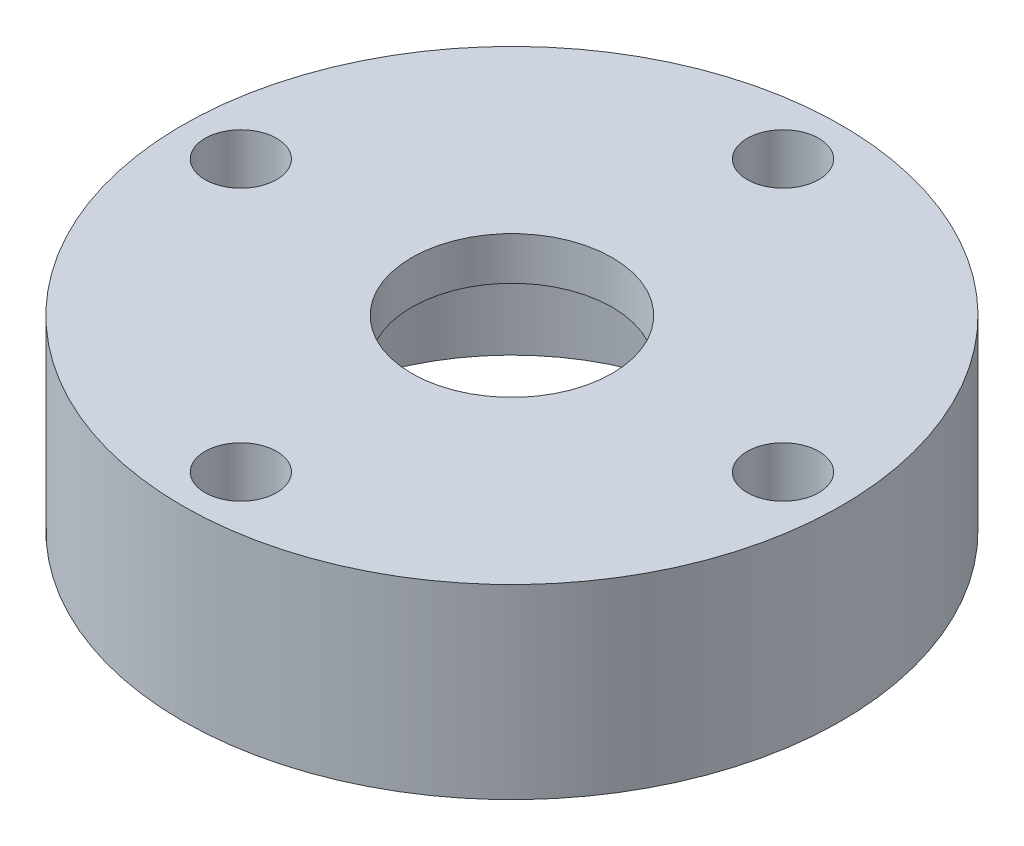
ISO-10303-21;
HEADER;
FILE_DESCRIPTION(('STEP AP214'),'2;1');
FILE_NAME('part.step','',(''),(''),'','','');
FILE_SCHEMA(('AUTOMOTIVE_DESIGN { 1 0 10303 214 1 1 1 1 }'));
ENDSEC;
DATA;
#1=APPLICATION_CONTEXT('core data for automotive mechanical design processes');
#2=APPLICATION_PROTOCOL_DEFINITION('international standard','automotive_design',2000,#1);
#3=PRODUCT_CONTEXT('',#1,'mechanical');
#4=PRODUCT('Part','Part','',(#3));
#5=PRODUCT_RELATED_PRODUCT_CATEGORY('part','',(#4));
#6=PRODUCT_DEFINITION_FORMATION('','',#4);
#7=PRODUCT_DEFINITION_CONTEXT('part definition',#1,'design');
#8=PRODUCT_DEFINITION('design','',#6,#7);
#9=PRODUCT_DEFINITION_SHAPE('','',#8);
#10=(LENGTH_UNIT() NAMED_UNIT(*) SI_UNIT(.MILLI.,.METRE.));
#11=(NAMED_UNIT(*) PLANE_ANGLE_UNIT() SI_UNIT($,.RADIAN.));
#12=(NAMED_UNIT(*) SI_UNIT($,.STERADIAN.) SOLID_ANGLE_UNIT());
#13=UNCERTAINTY_MEASURE_WITH_UNIT(LENGTH_MEASURE(1.E-05),#10,'distance_accuracy_value','');
#14=(GEOMETRIC_REPRESENTATION_CONTEXT(3) GLOBAL_UNCERTAINTY_ASSIGNED_CONTEXT((#13)) GLOBAL_UNIT_ASSIGNED_CONTEXT((#10,
#11,#12)) REPRESENTATION_CONTEXT('',''));
#15=CARTESIAN_POINT('',(0.,0.,0.));
#16=DIRECTION('',(0.,0.,1.));
#17=DIRECTION('',(1.,0.,0.));
#18=AXIS2_PLACEMENT_3D('',#15,#16,#17);
#19=CARTESIAN_POINT('',(0.,0.,0.));
#20=DIRECTION('',(0.,1.,0.));
#21=DIRECTION('',(0.,0.,1.));
#22=AXIS2_PLACEMENT_3D('',#19,#20,#21);
#23=PLANE('',#22);
#24=CARTESIAN_POINT('',(-9.4596855298338,0.,0.));
#25=DIRECTION('',(0.,1.,0.));
#26=DIRECTION('',(0.,0.,1.));
#27=AXIS2_PLACEMENT_3D('',#24,#25,#26);
#28=CIRCLE('',#27,1.25);
#29=CARTESIAN_POINT('',(-9.4596855298338,0.,1.2499999999999));
#30=VERTEX_POINT('',#29);
#31=EDGE_CURVE('E65',#30,#30,#28,.T.);
#32=ORIENTED_EDGE('',*,*,#31,.T.);
#33=EDGE_LOOP('',(#32));
#34=FACE_BOUND('',#33,.T.);
#35=CARTESIAN_POINT('',(0.,0.,9.4596855298338));
#36=DIRECTION('',(0.,1.,0.));
#37=DIRECTION('',(0.,0.,1.));
#38=AXIS2_PLACEMENT_3D('',#35,#36,#37);
#39=CIRCLE('',#38,1.25);
#40=CARTESIAN_POINT('',(0.,0.,10.7096855298338));
#41=VERTEX_POINT('',#40);
#42=EDGE_CURVE('E59',#41,#41,#39,.T.);
#43=ORIENTED_EDGE('',*,*,#42,.T.);
#44=EDGE_LOOP('',(#43));
#45=FACE_BOUND('',#44,.T.);
#46=CARTESIAN_POINT('',(9.4596855298338,0.,0.));
#47=DIRECTION('',(0.,1.,0.));
#48=DIRECTION('',(0.,0.,1.));
#49=AXIS2_PLACEMENT_3D('',#46,#47,#48);
#50=CIRCLE('',#49,1.25);
#51=CARTESIAN_POINT('',(9.4596855298338,0.,1.25000000000003));
#52=VERTEX_POINT('',#51);
#53=EDGE_CURVE('E53',#52,#52,#50,.T.);
#54=ORIENTED_EDGE('',*,*,#53,.T.);
#55=EDGE_LOOP('',(#54));
#56=FACE_BOUND('',#55,.T.);
#57=CARTESIAN_POINT('',(0.,0.,-9.4596855298338));
#58=DIRECTION('',(0.,1.,0.));
#59=DIRECTION('',(0.,0.,1.));
#60=AXIS2_PLACEMENT_3D('',#57,#58,#59);
#61=CIRCLE('',#60,1.25);
#62=CARTESIAN_POINT('',(0.,0.,-8.2096855298338));
#63=VERTEX_POINT('',#62);
#64=EDGE_CURVE('E49',#63,#63,#61,.T.);
#65=ORIENTED_EDGE('',*,*,#64,.T.);
#66=EDGE_LOOP('',(#65));
#67=FACE_BOUND('',#66,.T.);
#68=CARTESIAN_POINT('',(0.,0.,0.));
#69=DIRECTION('',(0.,1.,0.));
#70=DIRECTION('',(0.,0.,1.));
#71=AXIS2_PLACEMENT_3D('',#68,#69,#70);
#72=CIRCLE('',#71,11.5);
#73=CARTESIAN_POINT('',(0.,0.,11.5));
#74=VERTEX_POINT('',#73);
#75=EDGE_CURVE('E10',#74,#74,#72,.T.);
#76=ORIENTED_EDGE('',*,*,#75,.F.);
#77=EDGE_LOOP('',(#76));
#78=FACE_BOUND('',#77,.T.);
#79=CARTESIAN_POINT('',(0.,0.,0.));
#80=DIRECTION('',(0.,1.,0.));
#81=DIRECTION('',(0.,0.,1.));
#82=AXIS2_PLACEMENT_3D('',#79,#80,#81);
#83=CIRCLE('',#82,7.5);
#84=CARTESIAN_POINT('',(0.,0.,7.5));
#85=VERTEX_POINT('',#84);
#86=EDGE_CURVE('E36',#85,#85,#83,.T.);
#87=ORIENTED_EDGE('',*,*,#86,.T.);
#88=EDGE_LOOP('',(#87));
#89=FACE_BOUND('',#88,.T.);
#90=ADVANCED_FACE('F29',(#34,#45,#56,#67,#78,#89),#23,.F.);
#91=CARTESIAN_POINT('',(0.,5.,0.));
#92=DIRECTION('',(0.,-1.,0.));
#93=DIRECTION('',(0.,0.,-1.));
#94=AXIS2_PLACEMENT_3D('',#91,#92,#93);
#95=CYLINDRICAL_SURFACE('',#94,11.5);
#96=ORIENTED_EDGE('',*,*,#75,.T.);
#97=EDGE_LOOP('',(#96));
#98=FACE_BOUND('',#97,.T.);
#99=CARTESIAN_POINT('',(0.,6.5,0.));
#100=DIRECTION('',(0.,1.,0.));
#101=DIRECTION('',(0.,0.,1.));
#102=AXIS2_PLACEMENT_3D('',#99,#100,#101);
#103=CIRCLE('',#102,11.5);
#104=CARTESIAN_POINT('',(0.,6.5,11.5));
#105=VERTEX_POINT('',#104);
#106=EDGE_CURVE('E44',#105,#105,#103,.T.);
#107=ORIENTED_EDGE('',*,*,#106,.F.);
#108=EDGE_LOOP('',(#107));
#109=FACE_BOUND('',#108,.T.);
#110=ADVANCED_FACE('F31',(#98,#109),#95,.T.);
#111=CARTESIAN_POINT('',(0.,5.,0.));
#112=DIRECTION('',(0.,-1.,0.));
#113=DIRECTION('',(0.,0.,-1.));
#114=AXIS2_PLACEMENT_3D('',#111,#112,#113);
#115=CYLINDRICAL_SURFACE('',#114,7.5);
#116=CARTESIAN_POINT('',(0.,5.,0.));
#117=DIRECTION('',(0.,1.,0.));
#118=DIRECTION('',(0.,0.,1.));
#119=AXIS2_PLACEMENT_3D('',#116,#117,#118);
#120=CIRCLE('',#119,7.5);
#121=CARTESIAN_POINT('',(0.,5.,7.5));
#122=VERTEX_POINT('',#121);
#123=EDGE_CURVE('E40',#122,#122,#120,.T.);
#124=ORIENTED_EDGE('',*,*,#123,.T.);
#125=EDGE_LOOP('',(#124));
#126=FACE_BOUND('',#125,.T.);
#127=ORIENTED_EDGE('',*,*,#86,.F.);
#128=EDGE_LOOP('',(#127));
#129=FACE_BOUND('',#128,.T.);
#130=ADVANCED_FACE('F100',(#126,#129),#115,.F.);
#131=CARTESIAN_POINT('',(0.,5.,0.));
#132=DIRECTION('',(0.,1.,0.));
#133=DIRECTION('',(0.,0.,1.));
#134=AXIS2_PLACEMENT_3D('',#131,#132,#133);
#135=PLANE('',#134);
#136=CARTESIAN_POINT('',(0.,5.,0.));
#137=DIRECTION('',(0.,1.,0.));
#138=DIRECTION('',(0.,0.,1.));
#139=AXIS2_PLACEMENT_3D('',#136,#137,#138);
#140=CIRCLE('',#139,3.5);
#141=CARTESIAN_POINT('',(0.,5.,3.5));
#142=VERTEX_POINT('',#141);
#143=EDGE_CURVE('E71',#142,#142,#140,.T.);
#144=ORIENTED_EDGE('',*,*,#143,.T.);
#145=EDGE_LOOP('',(#144));
#146=FACE_BOUND('',#145,.T.);
#147=ORIENTED_EDGE('',*,*,#123,.F.);
#148=EDGE_LOOP('',(#147));
#149=FACE_BOUND('',#148,.T.);
#150=ADVANCED_FACE('F87',(#146,#149),#135,.F.);
#151=CARTESIAN_POINT('',(0.,6.5,0.));
#152=DIRECTION('',(0.,1.,0.));
#153=DIRECTION('',(0.,0.,1.));
#154=AXIS2_PLACEMENT_3D('',#151,#152,#153);
#155=PLANE('',#154);
#156=CARTESIAN_POINT('',(0.,6.5,0.));
#157=DIRECTION('',(0.,1.,0.));
#158=DIRECTION('',(0.,0.,1.));
#159=AXIS2_PLACEMENT_3D('',#156,#157,#158);
#160=CIRCLE('',#159,3.5);
#161=CARTESIAN_POINT('',(0.,6.5,3.5));
#162=VERTEX_POINT('',#161);
#163=EDGE_CURVE('E76',#162,#162,#160,.T.);
#164=ORIENTED_EDGE('',*,*,#163,.F.);
#165=EDGE_LOOP('',(#164));
#166=FACE_BOUND('',#165,.T.);
#167=CARTESIAN_POINT('',(-9.4596855298338,6.5,0.));
#168=DIRECTION('',(0.,1.,0.));
#169=DIRECTION('',(0.,0.,1.));
#170=AXIS2_PLACEMENT_3D('',#167,#168,#169);
#171=CIRCLE('',#170,1.25);
#172=CARTESIAN_POINT('',(-9.4596855298338,6.5,1.2499999999999));
#173=VERTEX_POINT('',#172);
#174=EDGE_CURVE('E68',#173,#173,#171,.T.);
#175=ORIENTED_EDGE('',*,*,#174,.F.);
#176=EDGE_LOOP('',(#175));
#177=FACE_BOUND('',#176,.T.);
#178=CARTESIAN_POINT('',(0.,6.5,9.4596855298338));
#179=DIRECTION('',(0.,1.,0.));
#180=DIRECTION('',(0.,0.,1.));
#181=AXIS2_PLACEMENT_3D('',#178,#179,#180);
#182=CIRCLE('',#181,1.25);
#183=CARTESIAN_POINT('',(0.,6.5,10.7096855298338));
#184=VERTEX_POINT('',#183);
#185=EDGE_CURVE('E62',#184,#184,#182,.T.);
#186=ORIENTED_EDGE('',*,*,#185,.F.);
#187=EDGE_LOOP('',(#186));
#188=FACE_BOUND('',#187,.T.);
#189=CARTESIAN_POINT('',(9.4596855298338,6.5,0.));
#190=DIRECTION('',(0.,1.,0.));
#191=DIRECTION('',(0.,0.,1.));
#192=AXIS2_PLACEMENT_3D('',#189,#190,#191);
#193=CIRCLE('',#192,1.25);
#194=CARTESIAN_POINT('',(9.4596855298338,6.5,1.25000000000003));
#195=VERTEX_POINT('',#194);
#196=EDGE_CURVE('E56',#195,#195,#193,.T.);
#197=ORIENTED_EDGE('',*,*,#196,.F.);
#198=EDGE_LOOP('',(#197));
#199=FACE_BOUND('',#198,.T.);
#200=CARTESIAN_POINT('',(0.,6.5,-9.4596855298338));
#201=DIRECTION('',(0.,1.,0.));
#202=DIRECTION('',(0.,0.,1.));
#203=AXIS2_PLACEMENT_3D('',#200,#201,#202);
#204=CIRCLE('',#203,1.25);
#205=CARTESIAN_POINT('',(0.,6.5,-8.2096855298338));
#206=VERTEX_POINT('',#205);
#207=EDGE_CURVE('E50',#206,#206,#204,.T.);
#208=ORIENTED_EDGE('',*,*,#207,.F.);
#209=EDGE_LOOP('',(#208));
#210=FACE_BOUND('',#209,.T.);
#211=ORIENTED_EDGE('',*,*,#106,.T.);
#212=EDGE_LOOP('',(#211));
#213=FACE_BOUND('',#212,.T.);
#214=ADVANCED_FACE('F83',(#166,#177,#188,#199,#210,#213),#155,.T.);
#215=CARTESIAN_POINT('',(0.,0.,-9.4596855298338));
#216=DIRECTION('',(0.,1.,0.));
#217=DIRECTION('',(0.,0.,1.));
#218=AXIS2_PLACEMENT_3D('',#215,#216,#217);
#219=CYLINDRICAL_SURFACE('',#218,1.25);
#220=ORIENTED_EDGE('',*,*,#64,.F.);
#221=EDGE_LOOP('',(#220));
#222=FACE_BOUND('',#221,.T.);
#223=ORIENTED_EDGE('',*,*,#207,.T.);
#224=EDGE_LOOP('',(#223));
#225=FACE_BOUND('',#224,.T.);
#226=ADVANCED_FACE('F86',(#222,#225),#219,.F.);
#227=CARTESIAN_POINT('',(9.4596855298338,0.,0.));
#228=DIRECTION('',(0.,1.,0.));
#229=DIRECTION('',(0.,0.,1.));
#230=AXIS2_PLACEMENT_3D('',#227,#228,#229);
#231=CYLINDRICAL_SURFACE('',#230,1.25);
#232=ORIENTED_EDGE('',*,*,#53,.F.);
#233=EDGE_LOOP('',(#232));
#234=FACE_BOUND('',#233,.T.);
#235=ORIENTED_EDGE('',*,*,#196,.T.);
#236=EDGE_LOOP('',(#235));
#237=FACE_BOUND('',#236,.T.);
#238=ADVANCED_FACE('F117',(#234,#237),#231,.F.);
#239=CARTESIAN_POINT('',(0.,0.,9.4596855298338));
#240=DIRECTION('',(0.,1.,0.));
#241=DIRECTION('',(0.,0.,1.));
#242=AXIS2_PLACEMENT_3D('',#239,#240,#241);
#243=CYLINDRICAL_SURFACE('',#242,1.25);
#244=ORIENTED_EDGE('',*,*,#42,.F.);
#245=EDGE_LOOP('',(#244));
#246=FACE_BOUND('',#245,.T.);
#247=ORIENTED_EDGE('',*,*,#185,.T.);
#248=EDGE_LOOP('',(#247));
#249=FACE_BOUND('',#248,.T.);
#250=ADVANCED_FACE('F121',(#246,#249),#243,.F.);
#251=CARTESIAN_POINT('',(-9.4596855298338,0.,0.));
#252=DIRECTION('',(0.,1.,0.));
#253=DIRECTION('',(0.,0.,1.));
#254=AXIS2_PLACEMENT_3D('',#251,#252,#253);
#255=CYLINDRICAL_SURFACE('',#254,1.25);
#256=ORIENTED_EDGE('',*,*,#31,.F.);
#257=EDGE_LOOP('',(#256));
#258=FACE_BOUND('',#257,.T.);
#259=ORIENTED_EDGE('',*,*,#174,.T.);
#260=EDGE_LOOP('',(#259));
#261=FACE_BOUND('',#260,.T.);
#262=ADVANCED_FACE('F125',(#258,#261),#255,.F.);
#263=CARTESIAN_POINT('',(0.,0.,0.));
#264=DIRECTION('',(0.,1.,0.));
#265=DIRECTION('',(0.,0.,1.));
#266=AXIS2_PLACEMENT_3D('',#263,#264,#265);
#267=CYLINDRICAL_SURFACE('',#266,3.5);
#268=ORIENTED_EDGE('',*,*,#163,.T.);
#269=EDGE_LOOP('',(#268));
#270=FACE_BOUND('',#269,.T.);
#271=ORIENTED_EDGE('',*,*,#143,.F.);
#272=EDGE_LOOP('',(#271));
#273=FACE_BOUND('',#272,.T.);
#274=ADVANCED_FACE('F80',(#270,#273),#267,.F.);
#275=CLOSED_SHELL('',(#90,#110,#130,#150,#214,#226,#238,#250,#262,#274));
#276=MANIFOLD_SOLID_BREP('B2',#275);
#277=ADVANCED_BREP_SHAPE_REPRESENTATION('',(#18,#276),#14);
#278=SHAPE_DEFINITION_REPRESENTATION(#9,#277);
ENDSEC;
END-ISO-10303-21;
